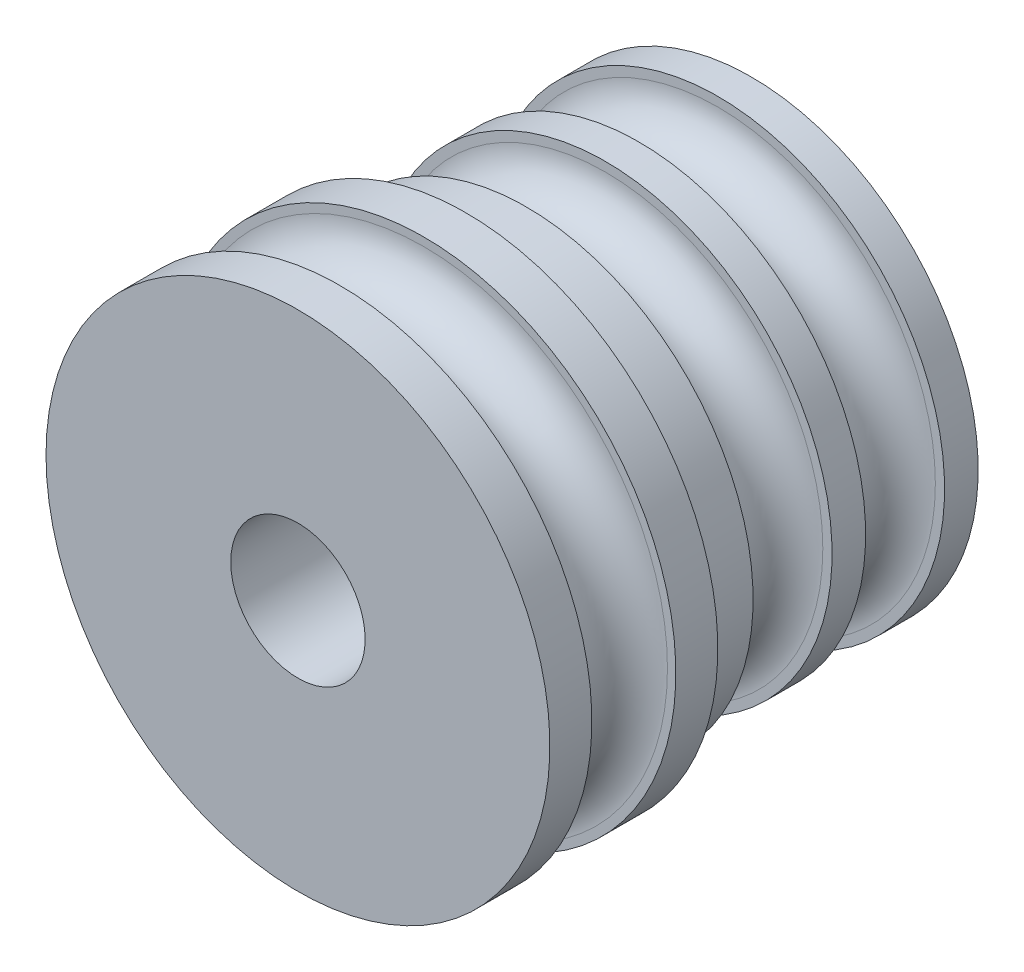
ISO-10303-21;
HEADER;
FILE_DESCRIPTION(('STEP AP214'),'2;1');
FILE_NAME('part.step','',(''),(''),'','','');
FILE_SCHEMA(('AUTOMOTIVE_DESIGN { 1 0 10303 214 1 1 1 1 }'));
ENDSEC;
DATA;
#1=APPLICATION_CONTEXT('core data for automotive mechanical design processes');
#2=APPLICATION_PROTOCOL_DEFINITION('international standard','automotive_design',2000,#1);
#3=PRODUCT_CONTEXT('',#1,'mechanical');
#4=PRODUCT('Part','Part','',(#3));
#5=PRODUCT_RELATED_PRODUCT_CATEGORY('part','',(#4));
#6=PRODUCT_DEFINITION_FORMATION('','',#4);
#7=PRODUCT_DEFINITION_CONTEXT('part definition',#1,'design');
#8=PRODUCT_DEFINITION('design','',#6,#7);
#9=PRODUCT_DEFINITION_SHAPE('','',#8);
#10=(LENGTH_UNIT() NAMED_UNIT(*) SI_UNIT(.MILLI.,.METRE.));
#11=(NAMED_UNIT(*) PLANE_ANGLE_UNIT() SI_UNIT($,.RADIAN.));
#12=(NAMED_UNIT(*) SI_UNIT($,.STERADIAN.) SOLID_ANGLE_UNIT());
#13=UNCERTAINTY_MEASURE_WITH_UNIT(LENGTH_MEASURE(1.E-05),#10,'distance_accuracy_value','');
#14=(GEOMETRIC_REPRESENTATION_CONTEXT(3) GLOBAL_UNCERTAINTY_ASSIGNED_CONTEXT((#13)) GLOBAL_UNIT_ASSIGNED_CONTEXT((#10,
#11,#12)) REPRESENTATION_CONTEXT('',''));
#15=CARTESIAN_POINT('',(0.,0.,0.));
#16=DIRECTION('',(0.,0.,1.));
#17=DIRECTION('',(1.,0.,0.));
#18=AXIS2_PLACEMENT_3D('',#15,#16,#17);
#19=CARTESIAN_POINT('',(-43.0563014577714,0.,-30.1096783867039));
#20=DIRECTION('',(0.,0.,1.));
#21=DIRECTION('',(1.,0.,0.));
#22=AXIS2_PLACEMENT_3D('',#19,#20,#21);
#23=PLANE('',#22);
#24=CARTESIAN_POINT('',(-56.5563014577714,0.,-30.1096783867039));
#25=DIRECTION('',(0.,0.,-1.));
#26=DIRECTION('',(-1.,0.,0.));
#27=AXIS2_PLACEMENT_3D('',#24,#25,#26);
#28=CIRCLE('',#27,4.);
#29=CARTESIAN_POINT('',(-60.5563014577714,0.,-30.1096783867039));
#30=VERTEX_POINT('',#29);
#31=EDGE_CURVE('E10',#30,#30,#28,.T.);
#32=ORIENTED_EDGE('',*,*,#31,.F.);
#33=EDGE_LOOP('',(#32));
#34=FACE_BOUND('',#33,.T.);
#35=CARTESIAN_POINT('',(-56.5563014577714,0.,-30.1096783867039));
#36=DIRECTION('',(0.,0.,-1.));
#37=DIRECTION('',(-1.,0.,0.));
#38=AXIS2_PLACEMENT_3D('',#35,#36,#37);
#39=CIRCLE('',#38,13.5);
#40=CARTESIAN_POINT('',(-70.0563014577714,0.,-30.1096783867039));
#41=VERTEX_POINT('',#40);
#42=EDGE_CURVE('E87',#41,#41,#39,.T.);
#43=ORIENTED_EDGE('',*,*,#42,.T.);
#44=EDGE_LOOP('',(#43));
#45=FACE_BOUND('',#44,.T.);
#46=ADVANCED_FACE('F29',(#34,#45),#23,.F.);
#47=CARTESIAN_POINT('',(-56.5563014577714,0.,-59.8877113313232));
#48=DIRECTION('',(0.,0.,-1.));
#49=DIRECTION('',(-1.,0.,0.));
#50=AXIS2_PLACEMENT_3D('',#47,#48,#49);
#51=CYLINDRICAL_SURFACE('',#50,4.);
#52=CARTESIAN_POINT('',(-56.5563014577714,0.,-3.1096783867039));
#53=DIRECTION('',(0.,0.,-1.));
#54=DIRECTION('',(-1.,0.,0.));
#55=AXIS2_PLACEMENT_3D('',#52,#53,#54);
#56=CIRCLE('',#55,4.);
#57=CARTESIAN_POINT('',(-60.5563014577714,0.,-3.1096783867039));
#58=VERTEX_POINT('',#57);
#59=EDGE_CURVE('E35',#58,#58,#56,.T.);
#60=ORIENTED_EDGE('',*,*,#59,.F.);
#61=EDGE_LOOP('',(#60));
#62=FACE_BOUND('',#61,.T.);
#63=ORIENTED_EDGE('',*,*,#31,.T.);
#64=EDGE_LOOP('',(#63));
#65=FACE_BOUND('',#64,.T.);
#66=ADVANCED_FACE('F184',(#62,#65),#51,.F.);
#67=CARTESIAN_POINT('',(-52.5563014577714,0.,-3.1096783867039));
#68=DIRECTION('',(0.,0.,-1.));
#69=DIRECTION('',(-1.,0.,0.));
#70=AXIS2_PLACEMENT_3D('',#67,#68,#69);
#71=PLANE('',#70);
#72=CARTESIAN_POINT('',(-56.5563014577714,0.,-3.1096783867039));
#73=DIRECTION('',(0.,0.,-1.));
#74=DIRECTION('',(-1.,0.,0.));
#75=AXIS2_PLACEMENT_3D('',#72,#73,#74);
#76=CIRCLE('',#75,15.);
#77=CARTESIAN_POINT('',(-71.5563014577714,0.,-3.1096783867039));
#78=VERTEX_POINT('',#77);
#79=EDGE_CURVE('E39',#78,#78,#76,.T.);
#80=ORIENTED_EDGE('',*,*,#79,.F.);
#81=EDGE_LOOP('',(#80));
#82=FACE_BOUND('',#81,.T.);
#83=ORIENTED_EDGE('',*,*,#59,.T.);
#84=EDGE_LOOP('',(#83));
#85=FACE_BOUND('',#84,.T.);
#86=ADVANCED_FACE('F179',(#82,#85),#71,.F.);
#87=CARTESIAN_POINT('',(-56.5563014577714,0.,-59.8877113313232));
#88=DIRECTION('',(0.,0.,-1.));
#89=DIRECTION('',(-1.,0.,0.));
#90=AXIS2_PLACEMENT_3D('',#87,#88,#89);
#91=CYLINDRICAL_SURFACE('',#90,15.);
#92=CARTESIAN_POINT('',(-56.5563014577714,0.,-5.60967838670391));
#93=DIRECTION('',(0.,0.,-1.));
#94=DIRECTION('',(-1.,0.,0.));
#95=AXIS2_PLACEMENT_3D('',#92,#93,#94);
#96=CIRCLE('',#95,15.);
#97=CARTESIAN_POINT('',(-71.5563014577714,0.,-5.60967838670391));
#98=VERTEX_POINT('',#97);
#99=EDGE_CURVE('E43',#98,#98,#96,.T.);
#100=ORIENTED_EDGE('',*,*,#99,.F.);
#101=EDGE_LOOP('',(#100));
#102=FACE_BOUND('',#101,.T.);
#103=ORIENTED_EDGE('',*,*,#79,.T.);
#104=EDGE_LOOP('',(#103));
#105=FACE_BOUND('',#104,.T.);
#106=ADVANCED_FACE('F173',(#102,#105),#91,.T.);
#107=CARTESIAN_POINT('',(-42.0563014577714,0.,-5.60967838670391));
#108=DIRECTION('',(0.,0.,1.));
#109=DIRECTION('',(1.,0.,0.));
#110=AXIS2_PLACEMENT_3D('',#107,#108,#109);
#111=PLANE('',#110);
#112=CARTESIAN_POINT('',(-56.5563014577714,0.,-5.60967838670391));
#113=DIRECTION('',(0.,0.,-1.));
#114=DIRECTION('',(-1.,0.,0.));
#115=AXIS2_PLACEMENT_3D('',#112,#113,#114);
#116=CIRCLE('',#115,14.5);
#117=CARTESIAN_POINT('',(-71.0563014577714,0.,-5.60967838670391));
#118=VERTEX_POINT('',#117);
#119=EDGE_CURVE('E48',#118,#118,#116,.T.);
#120=ORIENTED_EDGE('',*,*,#119,.F.);
#121=EDGE_LOOP('',(#120));
#122=FACE_BOUND('',#121,.T.);
#123=ORIENTED_EDGE('',*,*,#99,.T.);
#124=EDGE_LOOP('',(#123));
#125=FACE_BOUND('',#124,.T.);
#126=ADVANCED_FACE('F167',(#122,#125),#111,.F.);
#127=CARTESIAN_POINT('',(-56.5563014577714,0.,-8.1096783867039));
#128=DIRECTION('',(0.,0.,-1.));
#129=DIRECTION('',(-1.,0.,0.));
#130=AXIS2_PLACEMENT_3D('',#127,#128,#129);
#131=TOROIDAL_SURFACE('',#130,14.5,2.5);
#132=CARTESIAN_POINT('',(-56.5563014577714,0.,-10.6096783867039));
#133=DIRECTION('',(0.,0.,-1.));
#134=DIRECTION('',(-1.,0.,0.));
#135=AXIS2_PLACEMENT_3D('',#132,#133,#134);
#136=CIRCLE('',#135,14.5);
#137=CARTESIAN_POINT('',(-71.0563014577714,0.,-10.6096783867039));
#138=VERTEX_POINT('',#137);
#139=EDGE_CURVE('E51',#138,#138,#136,.T.);
#140=ORIENTED_EDGE('',*,*,#139,.F.);
#141=EDGE_LOOP('',(#140));
#142=FACE_BOUND('',#141,.T.);
#143=ORIENTED_EDGE('',*,*,#119,.T.);
#144=EDGE_LOOP('',(#143));
#145=FACE_BOUND('',#144,.T.);
#146=ADVANCED_FACE('F161',(#142,#145),#131,.F.);
#147=CARTESIAN_POINT('',(-42.0563014577714,0.,-10.6096783867039));
#148=DIRECTION('',(0.,0.,-1.));
#149=DIRECTION('',(-1.,0.,0.));
#150=AXIS2_PLACEMENT_3D('',#147,#148,#149);
#151=PLANE('',#150);
#152=CARTESIAN_POINT('',(-56.5563014577714,0.,-10.6096783867039));
#153=DIRECTION('',(0.,0.,-1.));
#154=DIRECTION('',(-1.,0.,0.));
#155=AXIS2_PLACEMENT_3D('',#152,#153,#154);
#156=CIRCLE('',#155,15.);
#157=CARTESIAN_POINT('',(-71.5563014577714,0.,-10.6096783867039));
#158=VERTEX_POINT('',#157);
#159=EDGE_CURVE('E54',#158,#158,#156,.T.);
#160=ORIENTED_EDGE('',*,*,#159,.F.);
#161=EDGE_LOOP('',(#160));
#162=FACE_BOUND('',#161,.T.);
#163=ORIENTED_EDGE('',*,*,#139,.T.);
#164=EDGE_LOOP('',(#163));
#165=FACE_BOUND('',#164,.T.);
#166=ADVANCED_FACE('F155',(#162,#165),#151,.F.);
#167=CARTESIAN_POINT('',(-56.5563014577714,0.,-59.8877113313232));
#168=DIRECTION('',(0.,0.,-1.));
#169=DIRECTION('',(-1.,0.,0.));
#170=AXIS2_PLACEMENT_3D('',#167,#168,#169);
#171=CYLINDRICAL_SURFACE('',#170,15.);
#172=CARTESIAN_POINT('',(-56.5563014577714,0.,-13.1096783867039));
#173=DIRECTION('',(0.,0.,-1.));
#174=DIRECTION('',(-1.,0.,0.));
#175=AXIS2_PLACEMENT_3D('',#172,#173,#174);
#176=CIRCLE('',#175,15.);
#177=CARTESIAN_POINT('',(-71.5563014577714,0.,-13.1096783867039));
#178=VERTEX_POINT('',#177);
#179=EDGE_CURVE('E57',#178,#178,#176,.T.);
#180=ORIENTED_EDGE('',*,*,#179,.F.);
#181=EDGE_LOOP('',(#180));
#182=FACE_BOUND('',#181,.T.);
#183=ORIENTED_EDGE('',*,*,#159,.T.);
#184=EDGE_LOOP('',(#183));
#185=FACE_BOUND('',#184,.T.);
#186=ADVANCED_FACE('F149',(#182,#185),#171,.T.);
#187=CARTESIAN_POINT('',(-41.5563014577714,0.,-13.1096783867039));
#188=DIRECTION('',(0.,0.,1.));
#189=DIRECTION('',(1.,0.,0.));
#190=AXIS2_PLACEMENT_3D('',#187,#188,#189);
#191=PLANE('',#190);
#192=CARTESIAN_POINT('',(-56.5563014577714,0.,-13.1096783867039));
#193=DIRECTION('',(0.,0.,-1.));
#194=DIRECTION('',(-1.,0.,0.));
#195=AXIS2_PLACEMENT_3D('',#192,#193,#194);
#196=CIRCLE('',#195,13.5);
#197=CARTESIAN_POINT('',(-70.0563014577714,0.,-13.1096783867039));
#198=VERTEX_POINT('',#197);
#199=EDGE_CURVE('E60',#198,#198,#196,.T.);
#200=ORIENTED_EDGE('',*,*,#199,.F.);
#201=EDGE_LOOP('',(#200));
#202=FACE_BOUND('',#201,.T.);
#203=ORIENTED_EDGE('',*,*,#179,.T.);
#204=EDGE_LOOP('',(#203));
#205=FACE_BOUND('',#204,.T.);
#206=ADVANCED_FACE('F143',(#202,#205),#191,.F.);
#207=CARTESIAN_POINT('',(-56.5563014577714,0.,-59.8877113313232));
#208=DIRECTION('',(0.,0.,-1.));
#209=DIRECTION('',(-1.,0.,0.));
#210=AXIS2_PLACEMENT_3D('',#207,#208,#209);
#211=CYLINDRICAL_SURFACE('',#210,13.5);
#212=CARTESIAN_POINT('',(-56.5563014577714,0.,-16.7096783867039));
#213=DIRECTION('',(0.,0.,-1.));
#214=DIRECTION('',(-1.,0.,0.));
#215=AXIS2_PLACEMENT_3D('',#212,#213,#214);
#216=CIRCLE('',#215,13.5);
#217=CARTESIAN_POINT('',(-70.0563014577714,0.,-16.7096783867039));
#218=VERTEX_POINT('',#217);
#219=EDGE_CURVE('E63',#218,#218,#216,.T.);
#220=ORIENTED_EDGE('',*,*,#219,.F.);
#221=EDGE_LOOP('',(#220));
#222=FACE_BOUND('',#221,.T.);
#223=ORIENTED_EDGE('',*,*,#199,.T.);
#224=EDGE_LOOP('',(#223));
#225=FACE_BOUND('',#224,.T.);
#226=ADVANCED_FACE('F137',(#222,#225),#211,.T.);
#227=CARTESIAN_POINT('',(-43.6063014577714,0.,-16.7096783867039));
#228=DIRECTION('',(0.,0.,1.));
#229=DIRECTION('',(1.,0.,0.));
#230=AXIS2_PLACEMENT_3D('',#227,#228,#229);
#231=PLANE('',#230);
#232=CARTESIAN_POINT('',(-56.5563014577714,0.,-16.7096783867039));
#233=DIRECTION('',(0.,0.,-1.));
#234=DIRECTION('',(-1.,0.,0.));
#235=AXIS2_PLACEMENT_3D('',#232,#233,#234);
#236=CIRCLE('',#235,12.95);
#237=CARTESIAN_POINT('',(-69.5063014577714,0.,-16.7096783867039));
#238=VERTEX_POINT('',#237);
#239=EDGE_CURVE('E66',#238,#238,#236,.T.);
#240=ORIENTED_EDGE('',*,*,#239,.F.);
#241=EDGE_LOOP('',(#240));
#242=FACE_BOUND('',#241,.T.);
#243=ORIENTED_EDGE('',*,*,#219,.T.);
#244=EDGE_LOOP('',(#243));
#245=FACE_BOUND('',#244,.T.);
#246=ADVANCED_FACE('F131',(#242,#245),#231,.F.);
#247=CARTESIAN_POINT('',(-56.5563014577714,0.,-19.0596783867039));
#248=DIRECTION('',(0.,0.,-1.));
#249=DIRECTION('',(-1.,0.,0.));
#250=AXIS2_PLACEMENT_3D('',#247,#248,#249);
#251=TOROIDAL_SURFACE('',#250,12.95,2.35);
#252=CARTESIAN_POINT('',(-56.5563014577714,0.,-21.4096783867039));
#253=DIRECTION('',(0.,0.,-1.));
#254=DIRECTION('',(-1.,0.,0.));
#255=AXIS2_PLACEMENT_3D('',#252,#253,#254);
#256=CIRCLE('',#255,12.95);
#257=CARTESIAN_POINT('',(-69.5063014577714,0.,-21.4096783867039));
#258=VERTEX_POINT('',#257);
#259=EDGE_CURVE('E69',#258,#258,#256,.T.);
#260=ORIENTED_EDGE('',*,*,#259,.F.);
#261=EDGE_LOOP('',(#260));
#262=FACE_BOUND('',#261,.T.);
#263=ORIENTED_EDGE('',*,*,#239,.T.);
#264=EDGE_LOOP('',(#263));
#265=FACE_BOUND('',#264,.T.);
#266=ADVANCED_FACE('F125',(#262,#265),#251,.F.);
#267=CARTESIAN_POINT('',(-43.6063014577714,0.,-21.4096783867039));
#268=DIRECTION('',(0.,0.,-1.));
#269=DIRECTION('',(-1.,0.,0.));
#270=AXIS2_PLACEMENT_3D('',#267,#268,#269);
#271=PLANE('',#270);
#272=CARTESIAN_POINT('',(-56.5563014577714,0.,-21.4096783867039));
#273=DIRECTION('',(0.,0.,-1.));
#274=DIRECTION('',(-1.,0.,0.));
#275=AXIS2_PLACEMENT_3D('',#272,#273,#274);
#276=CIRCLE('',#275,13.5);
#277=CARTESIAN_POINT('',(-70.0563014577714,0.,-21.4096783867039));
#278=VERTEX_POINT('',#277);
#279=EDGE_CURVE('E72',#278,#278,#276,.T.);
#280=ORIENTED_EDGE('',*,*,#279,.F.);
#281=EDGE_LOOP('',(#280));
#282=FACE_BOUND('',#281,.T.);
#283=ORIENTED_EDGE('',*,*,#259,.T.);
#284=EDGE_LOOP('',(#283));
#285=FACE_BOUND('',#284,.T.);
#286=ADVANCED_FACE('F119',(#282,#285),#271,.F.);
#287=CARTESIAN_POINT('',(-56.5563014577714,0.,-59.8877113313232));
#288=DIRECTION('',(0.,0.,-1.));
#289=DIRECTION('',(-1.,0.,0.));
#290=AXIS2_PLACEMENT_3D('',#287,#288,#289);
#291=CYLINDRICAL_SURFACE('',#290,13.5);
#292=CARTESIAN_POINT('',(-56.5563014577714,0.,-23.4096783867039));
#293=DIRECTION('',(0.,0.,-1.));
#294=DIRECTION('',(-1.,0.,0.));
#295=AXIS2_PLACEMENT_3D('',#292,#293,#294);
#296=CIRCLE('',#295,13.5);
#297=CARTESIAN_POINT('',(-70.0563014577714,0.,-23.4096783867039));
#298=VERTEX_POINT('',#297);
#299=EDGE_CURVE('E75',#298,#298,#296,.T.);
#300=ORIENTED_EDGE('',*,*,#299,.F.);
#301=EDGE_LOOP('',(#300));
#302=FACE_BOUND('',#301,.T.);
#303=ORIENTED_EDGE('',*,*,#279,.T.);
#304=EDGE_LOOP('',(#303));
#305=FACE_BOUND('',#304,.T.);
#306=ADVANCED_FACE('F113',(#302,#305),#291,.T.);
#307=CARTESIAN_POINT('',(-43.6063014577714,0.,-23.4096783867039));
#308=DIRECTION('',(0.,0.,1.));
#309=DIRECTION('',(1.,0.,0.));
#310=AXIS2_PLACEMENT_3D('',#307,#308,#309);
#311=PLANE('',#310);
#312=CARTESIAN_POINT('',(-56.5563014577714,0.,-23.4096783867039));
#313=DIRECTION('',(0.,0.,-1.));
#314=DIRECTION('',(-1.,0.,0.));
#315=AXIS2_PLACEMENT_3D('',#312,#313,#314);
#316=CIRCLE('',#315,12.95);
#317=CARTESIAN_POINT('',(-69.5063014577714,0.,-23.4096783867039));
#318=VERTEX_POINT('',#317);
#319=EDGE_CURVE('E78',#318,#318,#316,.T.);
#320=ORIENTED_EDGE('',*,*,#319,.F.);
#321=EDGE_LOOP('',(#320));
#322=FACE_BOUND('',#321,.T.);
#323=ORIENTED_EDGE('',*,*,#299,.T.);
#324=EDGE_LOOP('',(#323));
#325=FACE_BOUND('',#324,.T.);
#326=ADVANCED_FACE('F107',(#322,#325),#311,.F.);
#327=CARTESIAN_POINT('',(-56.5563014577714,0.,-25.7596783867039));
#328=DIRECTION('',(0.,0.,-1.));
#329=DIRECTION('',(-1.,0.,0.));
#330=AXIS2_PLACEMENT_3D('',#327,#328,#329);
#331=TOROIDAL_SURFACE('',#330,12.95,2.35);
#332=CARTESIAN_POINT('',(-56.5563014577714,0.,-28.1096783867039));
#333=DIRECTION('',(0.,0.,-1.));
#334=DIRECTION('',(-1.,0.,0.));
#335=AXIS2_PLACEMENT_3D('',#332,#333,#334);
#336=CIRCLE('',#335,12.95);
#337=CARTESIAN_POINT('',(-69.5063014577714,0.,-28.1096783867039));
#338=VERTEX_POINT('',#337);
#339=EDGE_CURVE('E81',#338,#338,#336,.T.);
#340=ORIENTED_EDGE('',*,*,#339,.F.);
#341=EDGE_LOOP('',(#340));
#342=FACE_BOUND('',#341,.T.);
#343=ORIENTED_EDGE('',*,*,#319,.T.);
#344=EDGE_LOOP('',(#343));
#345=FACE_BOUND('',#344,.T.);
#346=ADVANCED_FACE('F101',(#342,#345),#331,.F.);
#347=CARTESIAN_POINT('',(-43.6063014577714,0.,-28.1096783867039));
#348=DIRECTION('',(0.,0.,-1.));
#349=DIRECTION('',(-1.,0.,0.));
#350=AXIS2_PLACEMENT_3D('',#347,#348,#349);
#351=PLANE('',#350);
#352=CARTESIAN_POINT('',(-56.5563014577714,0.,-28.1096783867039));
#353=DIRECTION('',(0.,0.,-1.));
#354=DIRECTION('',(-1.,0.,0.));
#355=AXIS2_PLACEMENT_3D('',#352,#353,#354);
#356=CIRCLE('',#355,13.5);
#357=CARTESIAN_POINT('',(-70.0563014577714,0.,-28.1096783867039));
#358=VERTEX_POINT('',#357);
#359=EDGE_CURVE('E84',#358,#358,#356,.T.);
#360=ORIENTED_EDGE('',*,*,#359,.F.);
#361=EDGE_LOOP('',(#360));
#362=FACE_BOUND('',#361,.T.);
#363=ORIENTED_EDGE('',*,*,#339,.T.);
#364=EDGE_LOOP('',(#363));
#365=FACE_BOUND('',#364,.T.);
#366=ADVANCED_FACE('F95',(#362,#365),#351,.F.);
#367=CARTESIAN_POINT('',(-56.5563014577714,0.,-59.8877113313232));
#368=DIRECTION('',(0.,0.,-1.));
#369=DIRECTION('',(-1.,0.,0.));
#370=AXIS2_PLACEMENT_3D('',#367,#368,#369);
#371=CYLINDRICAL_SURFACE('',#370,13.5);
#372=ORIENTED_EDGE('',*,*,#42,.F.);
#373=EDGE_LOOP('',(#372));
#374=FACE_BOUND('',#373,.T.);
#375=ORIENTED_EDGE('',*,*,#359,.T.);
#376=EDGE_LOOP('',(#375));
#377=FACE_BOUND('',#376,.T.);
#378=ADVANCED_FACE('F92',(#374,#377),#371,.T.);
#379=CLOSED_SHELL('',(#46,#66,#86,#106,#126,#146,#166,#186,#206,#226,#246,#266,#286,#306,#326,
#346,#366,#378));
#380=MANIFOLD_SOLID_BREP('B2',#379);
#381=ADVANCED_BREP_SHAPE_REPRESENTATION('',(#18,#380),#14);
#382=SHAPE_DEFINITION_REPRESENTATION(#9,#381);
ENDSEC;
END-ISO-10303-21;
